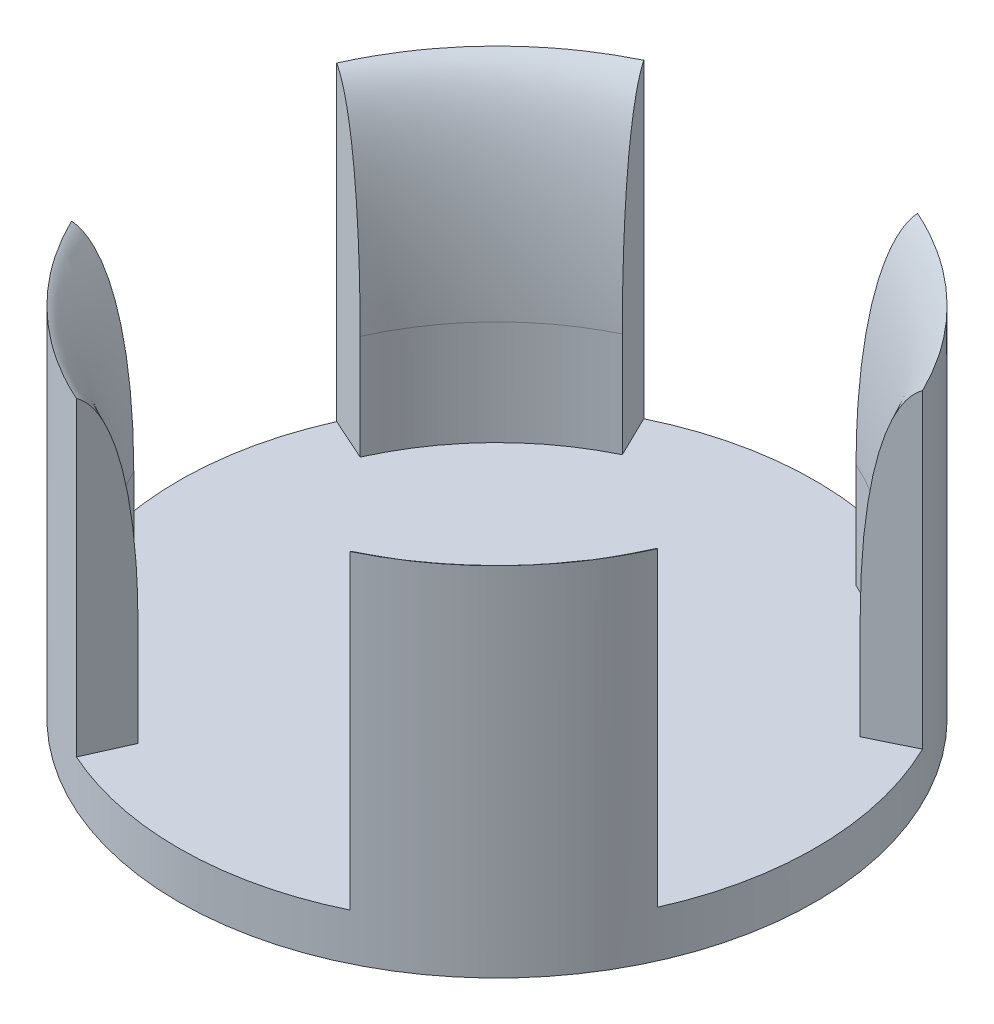
ISO-10303-21;
HEADER;
FILE_DESCRIPTION(('STEP AP214'),'2;1');
FILE_NAME('part.step','',(''),(''),'','','');
FILE_SCHEMA(('AUTOMOTIVE_DESIGN { 1 0 10303 214 1 1 1 1 }'));
ENDSEC;
DATA;
#1=APPLICATION_CONTEXT('core data for automotive mechanical design processes');
#2=APPLICATION_PROTOCOL_DEFINITION('international standard','automotive_design',2000,#1);
#3=PRODUCT_CONTEXT('',#1,'mechanical');
#4=PRODUCT('Part','Part','',(#3));
#5=PRODUCT_RELATED_PRODUCT_CATEGORY('part','',(#4));
#6=PRODUCT_DEFINITION_FORMATION('','',#4);
#7=PRODUCT_DEFINITION_CONTEXT('part definition',#1,'design');
#8=PRODUCT_DEFINITION('design','',#6,#7);
#9=PRODUCT_DEFINITION_SHAPE('','',#8);
#10=(LENGTH_UNIT() NAMED_UNIT(*) SI_UNIT(.MILLI.,.METRE.));
#11=(NAMED_UNIT(*) PLANE_ANGLE_UNIT() SI_UNIT($,.RADIAN.));
#12=(NAMED_UNIT(*) SI_UNIT($,.STERADIAN.) SOLID_ANGLE_UNIT());
#13=UNCERTAINTY_MEASURE_WITH_UNIT(LENGTH_MEASURE(1.E-05),#10,'distance_accuracy_value','');
#14=(GEOMETRIC_REPRESENTATION_CONTEXT(3) GLOBAL_UNCERTAINTY_ASSIGNED_CONTEXT((#13)) GLOBAL_UNIT_ASSIGNED_CONTEXT((#10,
#11,#12)) REPRESENTATION_CONTEXT('',''));
#15=CARTESIAN_POINT('',(0.,0.,0.));
#16=DIRECTION('',(0.,0.,1.));
#17=DIRECTION('',(1.,0.,0.));
#18=AXIS2_PLACEMENT_3D('',#15,#16,#17);
#19=CARTESIAN_POINT('',(0.,-3.,0.));
#20=DIRECTION('',(0.,1.,0.));
#21=DIRECTION('',(0.,0.,1.));
#22=AXIS2_PLACEMENT_3D('',#19,#20,#21);
#23=CYLINDRICAL_SURFACE('',#22,20.5);
#24=CARTESIAN_POINT('',(0.,-3.,0.));
#25=DIRECTION('',(0.,1.,0.));
#26=DIRECTION('',(0.,0.,1.));
#27=AXIS2_PLACEMENT_3D('',#24,#25,#26);
#28=CIRCLE('',#27,20.5);
#29=CARTESIAN_POINT('',(0.,-3.,20.5));
#30=VERTEX_POINT('',#29);
#31=EDGE_CURVE('E788',#30,#30,#28,.T.);
#32=ORIENTED_EDGE('',*,*,#31,.T.);
#33=EDGE_LOOP('',(#32));
#34=FACE_BOUND('',#33,.T.);
#35=CARTESIAN_POINT('',(0.,0.,0.));
#36=DIRECTION('',(0.,1.,0.));
#37=DIRECTION('',(0.,0.,1.));
#38=AXIS2_PLACEMENT_3D('',#35,#36,#37);
#39=CIRCLE('',#38,20.5);
#40=CARTESIAN_POINT('',(8.38234220932854,0.,-18.7079218270151));
#41=VERTEX_POINT('',#40);
#42=CARTESIAN_POINT('',(-8.97552418818276,0.,-18.4306800077302));
#43=VERTEX_POINT('',#42);
#44=EDGE_CURVE('E497',#41,#43,#39,.T.);
#45=ORIENTED_EDGE('',*,*,#44,.F.);
#46=DIRECTION('',(0.,-1.,0.));
#47=VECTOR('',#46,1.);
#48=CARTESIAN_POINT('',(8.38234220932854,20.,-18.7079218270151));
#49=LINE('',#48,#47);
#50=CARTESIAN_POINT('',(8.38231750512342,19.9999999999999,-18.7078666915498));
#51=VERTEX_POINT('',#50);
#52=EDGE_CURVE('E305',#51,#41,#49,.T.);
#53=ORIENTED_EDGE('',*,*,#52,.F.);
#54=CARTESIAN_POINT('',(18.7319601099859,19.9999999999999,-8.32848548284142));
#55=CARTESIAN_POINT('',(17.6685074621273,19.9999999999999,-10.7203432364903));
#56=CARTESIAN_POINT('',(16.1422940276784,20.000000000006,-12.9044962130154));
#57=CARTESIAN_POINT('',(12.3823921969383,19.9999999999938,-16.5461790897203));
#58=CARTESIAN_POINT('',(10.1506120525062,19.9999999999999,-18.0018607373686));
#59=CARTESIAN_POINT('',(7.7260118441926,19.9999999999999,-18.9883843700141));
#60=(BOUNDED_CURVE() B_SPLINE_CURVE(3,(#54,#55,#56,#57,#58,#59),.UNSPECIFIED.,.F.,
.F.) B_SPLINE_CURVE_WITH_KNOTS((4,2,4),(1.98916195742302,2.37216524610035,2.75516853477769),
.UNSPECIFIED.) CURVE() GEOMETRIC_REPRESENTATION_ITEM() RATIONAL_B_SPLINE_CURVE((1.,1.,1.,1.,1.,1.)) REPRESENTATION_ITEM(''));
#61=CARTESIAN_POINT('',(18.4305713709548,20.0000000000001,-8.97547128335208));
#62=VERTEX_POINT('',#61);
#63=EDGE_CURVE('E291',#62,#51,#60,.T.);
#64=ORIENTED_EDGE('',*,*,#63,.F.);
#65=DIRECTION('',(0.,-1.,0.));
#66=VECTOR('',#65,1.);
#67=CARTESIAN_POINT('',(18.4306800077302,20.,-8.97552418818276));
#68=LINE('',#67,#66);
#69=CARTESIAN_POINT('',(18.4306800077302,0.,-8.97552418818276));
#70=VERTEX_POINT('',#69);
#71=EDGE_CURVE('E343',#62,#70,#68,.T.);
#72=ORIENTED_EDGE('',*,*,#71,.T.);
#73=CARTESIAN_POINT('',(18.7079218270151,0.,8.38234220932854));
#74=VERTEX_POINT('',#73);
#75=EDGE_CURVE('E351',#74,#70,#39,.T.);
#76=ORIENTED_EDGE('',*,*,#75,.F.);
#77=DIRECTION('',(0.,-1.,0.));
#78=VECTOR('',#77,1.);
#79=CARTESIAN_POINT('',(18.7079218270151,20.,8.38234220932854));
#80=LINE('',#79,#78);
#81=CARTESIAN_POINT('',(18.7078666915517,20.,8.38231750512425));
#82=VERTEX_POINT('',#81);
#83=EDGE_CURVE('E823',#82,#74,#80,.T.);
#84=ORIENTED_EDGE('',*,*,#83,.F.);
#85=CARTESIAN_POINT('',(8.32848548284142,19.9999999999999,18.7319601099859));
#86=CARTESIAN_POINT('',(10.7203432364824,20.0000000000182,17.668507462122));
#87=CARTESIAN_POINT('',(12.9044962130225,19.9999999999999,16.1422940276777));
#88=CARTESIAN_POINT('',(16.5461790897131,19.9999999999999,12.382392196939));
#89=CARTESIAN_POINT('',(18.0018607373868,19.9999999999999,10.1506120525109));
#90=CARTESIAN_POINT('',(18.9883843700141,19.9999999999999,7.72601184419258));
#91=(BOUNDED_CURVE() B_SPLINE_CURVE(3,(#85,#86,#87,#88,#89,#90),.UNSPECIFIED.,.F.,
.F.) B_SPLINE_CURVE_WITH_KNOTS((4,2,4),(0.41836563062812,0.801368919305455,1.18437220798279),
.UNSPECIFIED.) CURVE() GEOMETRIC_REPRESENTATION_ITEM() RATIONAL_B_SPLINE_CURVE((1.,1.,1.,1.,1.,1.)) REPRESENTATION_ITEM(''));
#92=CARTESIAN_POINT('',(8.9754712833513,20.0000000000041,18.4305713709532));
#93=VERTEX_POINT('',#92);
#94=EDGE_CURVE('E799',#93,#82,#91,.T.);
#95=ORIENTED_EDGE('',*,*,#94,.F.);
#96=DIRECTION('',(0.,-1.,0.));
#97=VECTOR('',#96,1.);
#98=CARTESIAN_POINT('',(8.97552418818276,20.,18.4306800077302));
#99=LINE('',#98,#97);
#100=CARTESIAN_POINT('',(8.97552418818276,0.,18.4306800077302));
#101=VERTEX_POINT('',#100);
#102=EDGE_CURVE('E202',#93,#101,#99,.T.);
#103=ORIENTED_EDGE('',*,*,#102,.T.);
#104=CARTESIAN_POINT('',(-8.38234220932854,0.,18.7079218270151));
#105=VERTEX_POINT('',#104);
#106=EDGE_CURVE('E820',#105,#101,#39,.T.);
#107=ORIENTED_EDGE('',*,*,#106,.F.);
#108=DIRECTION('',(0.,-1.,0.));
#109=VECTOR('',#108,1.);
#110=CARTESIAN_POINT('',(-8.38234220932854,20.,18.7079218270151));
#111=LINE('',#110,#109);
#112=CARTESIAN_POINT('',(-8.38231750512343,20.0000000000007,18.7078666915498));
#113=VERTEX_POINT('',#112);
#114=EDGE_CURVE('E220',#113,#105,#111,.T.);
#115=ORIENTED_EDGE('',*,*,#114,.F.);
#116=CARTESIAN_POINT('',(-18.7319601099859,19.9999999999999,8.32848548284142));
#117=CARTESIAN_POINT('',(-17.6685074621352,20.000000000006,10.7203432364938));
#118=CARTESIAN_POINT('',(-16.1422940276831,19.9999999999999,12.9044962130175));
#119=CARTESIAN_POINT('',(-12.3823921969336,19.9999999999999,16.5461790897182));
#120=CARTESIAN_POINT('',(-10.1506120525088,20.000000000006,18.0018607373679));
#121=CARTESIAN_POINT('',(-7.72601184419254,19.9999999999999,18.9883843700142));
#122=(BOUNDED_CURVE() B_SPLINE_CURVE(3,(#116,#117,#118,#119,#120,#121),.UNSPECIFIED.,.F.,
.F.) B_SPLINE_CURVE_WITH_KNOTS((4,2,4),(5.13075461101281,5.51375789969014,5.89676118836748),
.UNSPECIFIED.) CURVE() GEOMETRIC_REPRESENTATION_ITEM() RATIONAL_B_SPLINE_CURVE((1.,1.,1.,1.,1.,1.)) REPRESENTATION_ITEM(''));
#123=CARTESIAN_POINT('',(-18.4305713709567,20.0000000000013,8.97547128335299));
#124=VERTEX_POINT('',#123);
#125=EDGE_CURVE('E174',#124,#113,#122,.T.);
#126=ORIENTED_EDGE('',*,*,#125,.F.);
#127=DIRECTION('',(0.,-1.,0.));
#128=VECTOR('',#127,1.);
#129=CARTESIAN_POINT('',(-18.4306800077302,20.,8.97552418818276));
#130=LINE('',#129,#128);
#131=CARTESIAN_POINT('',(-18.4306800077302,0.,8.97552418818276));
#132=VERTEX_POINT('',#131);
#133=EDGE_CURVE('E252',#124,#132,#130,.T.);
#134=ORIENTED_EDGE('',*,*,#133,.T.);
#135=CARTESIAN_POINT('',(-18.7079218270151,0.,-8.38234220932854));
#136=VERTEX_POINT('',#135);
#137=EDGE_CURVE('E200',#136,#132,#39,.T.);
#138=ORIENTED_EDGE('',*,*,#137,.F.);
#139=DIRECTION('',(0.,-1.,0.));
#140=VECTOR('',#139,1.);
#141=CARTESIAN_POINT('',(-18.7079218270151,20.,-8.38234220932854));
#142=LINE('',#141,#140);
#143=CARTESIAN_POINT('',(-18.7078666915496,19.9999999999972,-8.38231750512331));
#144=VERTEX_POINT('',#143);
#145=EDGE_CURVE('E500',#144,#136,#142,.T.);
#146=ORIENTED_EDGE('',*,*,#145,.F.);
#147=CARTESIAN_POINT('',(-8.32848548284142,19.9999999999999,-18.7319601099859));
#148=CARTESIAN_POINT('',(-10.7203432364868,19.9999999999999,-17.6685074621173));
#149=CARTESIAN_POINT('',(-12.9044962130154,20.000000000006,-16.1422940276815));
#150=CARTESIAN_POINT('',(-16.5461790897203,19.9999999999938,-12.3823921969352));
#151=CARTESIAN_POINT('',(-18.0018607373655,19.9999999999756,-10.1506120525072));
#152=CARTESIAN_POINT('',(-18.9883843700141,19.9999999999999,-7.72601184419257));
#153=(BOUNDED_CURVE() B_SPLINE_CURVE(3,(#147,#148,#149,#150,#151,#152),.UNSPECIFIED.,.F.,
.F.) B_SPLINE_CURVE_WITH_KNOTS((4,2,4),(3.55995828421791,3.94296157289525,4.32596486157258),
.UNSPECIFIED.) CURVE() GEOMETRIC_REPRESENTATION_ITEM() RATIONAL_B_SPLINE_CURVE((1.,1.,1.,1.,1.,1.)) REPRESENTATION_ITEM(''));
#154=CARTESIAN_POINT('',(-8.97547128335108,20.0000000000001,-18.4305713709528));
#155=VERTEX_POINT('',#154);
#156=EDGE_CURVE('E89',#155,#144,#153,.T.);
#157=ORIENTED_EDGE('',*,*,#156,.F.);
#158=DIRECTION('',(0.,-1.,0.));
#159=VECTOR('',#158,1.);
#160=CARTESIAN_POINT('',(-8.97552418818276,20.,-18.4306800077302));
#161=LINE('',#160,#159);
#162=EDGE_CURVE('E285',#155,#43,#161,.T.);
#163=ORIENTED_EDGE('',*,*,#162,.T.);
#164=EDGE_LOOP('',(#45,#53,#64,#72,#76,#84,#95,#103,#107,#115,#126,#134,#138,#146,#157,#163));
#165=FACE_BOUND('',#164,.T.);
#166=ADVANCED_FACE('F46',(#34,#165),#23,.T.);
#167=CARTESIAN_POINT('',(0.,-3.,0.));
#168=DIRECTION('',(0.,1.,0.));
#169=DIRECTION('',(0.,0.,1.));
#170=AXIS2_PLACEMENT_3D('',#167,#168,#169);
#171=PLANE('',#170);
#172=ORIENTED_EDGE('',*,*,#31,.F.);
#173=EDGE_LOOP('',(#172));
#174=FACE_BOUND('',#173,.T.);
#175=ADVANCED_FACE('F437',(#174),#171,.F.);
#176=CARTESIAN_POINT('',(0.,0.,0.));
#177=DIRECTION('',(0.,1.,0.));
#178=DIRECTION('',(0.,0.,1.));
#179=AXIS2_PLACEMENT_3D('',#176,#177,#178);
#180=PLANE('',#179);
#181=ORIENTED_EDGE('',*,*,#106,.T.);
#182=DIRECTION('',(0.437830448204037,0.,0.899057561352694));
#183=VECTOR('',#182,1.);
#184=CARTESIAN_POINT('',(0.,0.,0.));
#185=LINE('',#184,#183);
#186=CARTESIAN_POINT('',(7.66203284357065,0.,15.7335073236721));
#187=VERTEX_POINT('',#186);
#188=EDGE_CURVE('E810',#187,#101,#185,.T.);
#189=ORIENTED_EDGE('',*,*,#188,.F.);
#190=CARTESIAN_POINT('',(0.,0.,0.));
#191=DIRECTION('',(0.,1.,0.));
#192=DIRECTION('',(0.,0.,1.));
#193=AXIS2_PLACEMENT_3D('',#190,#191,#192);
#194=CIRCLE('',#193,17.5);
#195=CARTESIAN_POINT('',(15.9701771694032,0.,7.15565798357315));
#196=VERTEX_POINT('',#195);
#197=EDGE_CURVE('E804',#187,#196,#194,.T.);
#198=ORIENTED_EDGE('',*,*,#197,.T.);
#199=DIRECTION('',(0.912581552537324,0.,0.408894741918465));
#200=VECTOR('',#199,1.);
#201=CARTESIAN_POINT('',(0.,0.,0.));
#202=LINE('',#201,#200);
#203=EDGE_CURVE('E808',#196,#74,#202,.T.);
#204=ORIENTED_EDGE('',*,*,#203,.T.);
#205=ORIENTED_EDGE('',*,*,#75,.T.);
#206=DIRECTION('',(0.899057561352694,0.,-0.437830448204037));
#207=VECTOR('',#206,1.);
#208=CARTESIAN_POINT('',(0.,0.,0.));
#209=LINE('',#208,#207);
#210=CARTESIAN_POINT('',(15.7335073236721,0.,-7.66203284357065));
#211=VERTEX_POINT('',#210);
#212=EDGE_CURVE('E281',#211,#70,#209,.T.);
#213=ORIENTED_EDGE('',*,*,#212,.F.);
#214=CARTESIAN_POINT('',(0.,0.,0.));
#215=DIRECTION('',(0.,1.,0.));
#216=DIRECTION('',(0.,0.,1.));
#217=AXIS2_PLACEMENT_3D('',#214,#215,#216);
#218=CIRCLE('',#217,17.5);
#219=CARTESIAN_POINT('',(7.15565798357314,0.,-15.9701771694032));
#220=VERTEX_POINT('',#219);
#221=EDGE_CURVE('E288',#211,#220,#218,.T.);
#222=ORIENTED_EDGE('',*,*,#221,.T.);
#223=DIRECTION('',(0.408894741918465,0.,-0.912581552537324));
#224=VECTOR('',#223,1.);
#225=CARTESIAN_POINT('',(0.,0.,0.));
#226=LINE('',#225,#224);
#227=EDGE_CURVE('E284',#220,#41,#226,.T.);
#228=ORIENTED_EDGE('',*,*,#227,.T.);
#229=ORIENTED_EDGE('',*,*,#44,.T.);
#230=DIRECTION('',(-0.437830448204037,0.,-0.899057561352693));
#231=VECTOR('',#230,1.);
#232=CARTESIAN_POINT('',(0.,0.,0.));
#233=LINE('',#232,#231);
#234=CARTESIAN_POINT('',(-7.66203284357065,0.,-15.7335073236721));
#235=VERTEX_POINT('',#234);
#236=EDGE_CURVE('E259',#235,#43,#233,.T.);
#237=ORIENTED_EDGE('',*,*,#236,.F.);
#238=CARTESIAN_POINT('',(0.,0.,0.));
#239=DIRECTION('',(0.,1.,0.));
#240=DIRECTION('',(0.,0.,1.));
#241=AXIS2_PLACEMENT_3D('',#238,#239,#240);
#242=CIRCLE('',#241,17.5);
#243=CARTESIAN_POINT('',(-15.9701771694032,0.,-7.15565798357314));
#244=VERTEX_POINT('',#243);
#245=EDGE_CURVE('E277',#235,#244,#242,.T.);
#246=ORIENTED_EDGE('',*,*,#245,.T.);
#247=DIRECTION('',(-0.912581552537324,0.,-0.408894741918465));
#248=VECTOR('',#247,1.);
#249=CARTESIAN_POINT('',(0.,0.,0.));
#250=LINE('',#249,#248);
#251=EDGE_CURVE('E493',#244,#136,#250,.T.);
#252=ORIENTED_EDGE('',*,*,#251,.T.);
#253=ORIENTED_EDGE('',*,*,#137,.T.);
#254=DIRECTION('',(-0.899057561352694,0.,0.437830448204037));
#255=VECTOR('',#254,1.);
#256=CARTESIAN_POINT('',(0.,0.,0.));
#257=LINE('',#256,#255);
#258=CARTESIAN_POINT('',(-15.7335073236721,0.,7.66203284357065));
#259=VERTEX_POINT('',#258);
#260=EDGE_CURVE('E184',#259,#132,#257,.T.);
#261=ORIENTED_EDGE('',*,*,#260,.F.);
#262=CARTESIAN_POINT('',(0.,0.,0.));
#263=DIRECTION('',(0.,1.,0.));
#264=DIRECTION('',(0.,0.,1.));
#265=AXIS2_PLACEMENT_3D('',#262,#263,#264);
#266=CIRCLE('',#265,17.5);
#267=CARTESIAN_POINT('',(-7.15565798357314,0.,15.9701771694032));
#268=VERTEX_POINT('',#267);
#269=EDGE_CURVE('E197',#259,#268,#266,.T.);
#270=ORIENTED_EDGE('',*,*,#269,.T.);
#271=DIRECTION('',(-0.408894741918465,0.,0.912581552537324));
#272=VECTOR('',#271,1.);
#273=CARTESIAN_POINT('',(0.,0.,0.));
#274=LINE('',#273,#272);
#275=EDGE_CURVE('E201',#268,#105,#274,.T.);
#276=ORIENTED_EDGE('',*,*,#275,.T.);
#277=EDGE_LOOP('',(#181,#189,#198,#204,#205,#213,#222,#228,#229,#237,#246,#252,#253,#261,#270,#276));
#278=FACE_BOUND('',#277,.T.);
#279=ADVANCED_FACE('F196',(#278),#180,.T.);
#280=CARTESIAN_POINT('',(0.,20.,0.));
#281=DIRECTION('',(-0.437830448204037,0.,-0.899057561352694));
#282=DIRECTION('',(-0.899057561352694,0.,0.437830448204037));
#283=AXIS2_PLACEMENT_3D('',#280,#281,#282);
#284=PLANE('',#283);
#285=ORIENTED_EDGE('',*,*,#71,.F.);
#286=CARTESIAN_POINT('',(15.7334145849637,6.73350083857774,-7.66198768091128));
#287=CARTESIAN_POINT('',(15.7334145849574,18.4170654409668,-7.66198768090835));
#288=CARTESIAN_POINT('',(18.4305713709548,20.0000000000001,-8.97547128335218));
#289=(BOUNDED_CURVE() B_SPLINE_CURVE(2,(#286,#287,#288),.UNSPECIFIED.,.F.,
.F.) B_SPLINE_CURVE_WITH_KNOTS((3,3),(0.,1.),
.UNSPECIFIED.) CURVE() GEOMETRIC_REPRESENTATION_ITEM() RATIONAL_B_SPLINE_CURVE((1.,
0.856348838577675,1.)) REPRESENTATION_ITEM(''));
#290=CARTESIAN_POINT('',(15.7334609612195,6.73350083857774,-7.66201024807991));
#291=VERTEX_POINT('',#290);
#292=EDGE_CURVE('E356',#62,#291,#289,.F.);
#293=ORIENTED_EDGE('',*,*,#292,.T.);
#294=DIRECTION('',(0.,-1.,0.));
#295=VECTOR('',#294,1.);
#296=CARTESIAN_POINT('',(15.7335073236721,20.,-7.66203284357065));
#297=LINE('',#296,#295);
#298=EDGE_CURVE('E297',#291,#211,#297,.T.);
#299=ORIENTED_EDGE('',*,*,#298,.T.);
#300=ORIENTED_EDGE('',*,*,#212,.T.);
#301=EDGE_LOOP('',(#285,#293,#299,#300));
#302=FACE_BOUND('',#301,.T.);
#303=ADVANCED_FACE('F334',(#302),#284,.F.);
#304=CARTESIAN_POINT('',(0.,20.,0.));
#305=DIRECTION('',(-0.912581552537324,0.,-0.408894741918465));
#306=DIRECTION('',(-0.408894741918465,0.,0.912581552537324));
#307=AXIS2_PLACEMENT_3D('',#304,#305,#306);
#308=PLANE('',#307);
#309=DIRECTION('',(0.,-1.,0.));
#310=VECTOR('',#309,1.);
#311=CARTESIAN_POINT('',(7.15565798357314,20.,-15.9701771694032));
#312=LINE('',#311,#310);
#313=CARTESIAN_POINT('',(7.15563689461738,6.7335008385741,-15.9701301025421));
#314=VERTEX_POINT('',#313);
#315=EDGE_CURVE('E300',#314,#220,#312,.T.);
#316=ORIENTED_EDGE('',*,*,#315,.F.);
#317=CARTESIAN_POINT('',(8.38229280091843,19.9999999999998,-18.7078115560845));
#318=CARTESIAN_POINT('',(7.15561580565765,18.4170654409652,-15.9700830356737));
#319=CARTESIAN_POINT('',(7.15561580566179,6.7335008385741,-15.970083035681));
#320=(BOUNDED_CURVE() B_SPLINE_CURVE(2,(#317,#318,#319),.UNSPECIFIED.,.F.,
.F.) B_SPLINE_CURVE_WITH_KNOTS((3,3),(0.,1.),
.UNSPECIFIED.) CURVE() GEOMETRIC_REPRESENTATION_ITEM() RATIONAL_B_SPLINE_CURVE((1.,
0.856348838577675,1.)) REPRESENTATION_ITEM(''));
#321=EDGE_CURVE('E361',#314,#51,#320,.F.);
#322=ORIENTED_EDGE('',*,*,#321,.T.);
#323=ORIENTED_EDGE('',*,*,#52,.T.);
#324=ORIENTED_EDGE('',*,*,#227,.F.);
#325=EDGE_LOOP('',(#316,#322,#323,#324));
#326=FACE_BOUND('',#325,.T.);
#327=ADVANCED_FACE('F329',(#326),#308,.T.);
#328=CARTESIAN_POINT('',(0.,20.,0.));
#329=DIRECTION('',(0.,-1.,0.));
#330=DIRECTION('',(0.,0.,-1.));
#331=AXIS2_PLACEMENT_3D('',#328,#329,#330);
#332=CYLINDRICAL_SURFACE('',#331,17.5);
#333=ORIENTED_EDGE('',*,*,#298,.F.);
#334=CARTESIAN_POINT('',(6.59537596455465,6.73350083857832,-16.2095964134267));
#335=CARTESIAN_POINT('',(8.66515663018708,6.73350083856005,-15.3674420928722));
#336=CARTESIAN_POINT('',(10.5703348022635,6.73350083857375,-14.1247870278088));
#337=CARTESIAN_POINT('',(13.7800070967995,6.73350083858289,-11.0160333525754));
#338=CARTESIAN_POINT('',(15.0828722237773,6.73350083857527,-9.15151251895895));
#339=CARTESIAN_POINT('',(15.9906976548659,6.73350083857832,-7.10968272925486));
#340=(BOUNDED_CURVE() B_SPLINE_CURVE(3,(#334,#335,#336,#337,#338,#339),.UNSPECIFIED.,.F.,
.F.) B_SPLINE_CURVE_WITH_KNOTS((4,2,4),(1.98916195742302,2.37216524610035,2.75516853477769),
.UNSPECIFIED.) CURVE() GEOMETRIC_REPRESENTATION_ITEM() RATIONAL_B_SPLINE_CURVE((1.,1.,1.,1.,1.,1.)) REPRESENTATION_ITEM(''));
#341=EDGE_CURVE('E311',#291,#314,#340,.F.);
#342=ORIENTED_EDGE('',*,*,#341,.T.);
#343=ORIENTED_EDGE('',*,*,#315,.T.);
#344=ORIENTED_EDGE('',*,*,#221,.F.);
#345=EDGE_LOOP('',(#333,#342,#343,#344));
#346=FACE_BOUND('',#345,.T.);
#347=ADVANCED_FACE('F318',(#346),#332,.F.);
#348=CARTESIAN_POINT('',(0.,20.,0.));
#349=DIRECTION('',(-0.899057561352693,0.,0.437830448204037));
#350=DIRECTION('',(0.437830448204037,0.,0.899057561352693));
#351=AXIS2_PLACEMENT_3D('',#348,#349,#350);
#352=PLANE('',#351);
#353=ORIENTED_EDGE('',*,*,#162,.F.);
#354=CARTESIAN_POINT('',(-7.66198768091121,6.73350083858007,-15.7334145849637));
#355=CARTESIAN_POINT('',(-7.66198768091212,18.4170654409653,-15.7334145849659));
#356=CARTESIAN_POINT('',(-8.9754712833513,20.0000000000001,-18.4305713709527));
#357=(BOUNDED_CURVE() B_SPLINE_CURVE(2,(#354,#355,#356),.UNSPECIFIED.,.F.,
.F.) B_SPLINE_CURVE_WITH_KNOTS((3,3),(0.,1.),
.UNSPECIFIED.) CURVE() GEOMETRIC_REPRESENTATION_ITEM() RATIONAL_B_SPLINE_CURVE((1.,
0.856348838577675,1.)) REPRESENTATION_ITEM(''));
#358=CARTESIAN_POINT('',(-7.6620102480799,6.73350083858007,-15.7334609612195));
#359=VERTEX_POINT('',#358);
#360=EDGE_CURVE('E12',#155,#359,#357,.F.);
#361=ORIENTED_EDGE('',*,*,#360,.T.);
#362=DIRECTION('',(0.,-1.,0.));
#363=VECTOR('',#362,1.);
#364=CARTESIAN_POINT('',(-7.66203284357065,20.,-15.7335073236721));
#365=LINE('',#364,#363);
#366=EDGE_CURVE('E97',#359,#235,#365,.T.);
#367=ORIENTED_EDGE('',*,*,#366,.T.);
#368=ORIENTED_EDGE('',*,*,#236,.T.);
#369=EDGE_LOOP('',(#353,#361,#367,#368));
#370=FACE_BOUND('',#369,.T.);
#371=ADVANCED_FACE('F328',(#370),#352,.F.);
#372=CARTESIAN_POINT('',(0.,20.,0.));
#373=DIRECTION('',(-0.408894741918465,0.,0.912581552537324));
#374=DIRECTION('',(0.912581552537324,0.,0.408894741918465));
#375=AXIS2_PLACEMENT_3D('',#372,#373,#374);
#376=PLANE('',#375);
#377=DIRECTION('',(0.,-1.,0.));
#378=VECTOR('',#377,1.);
#379=CARTESIAN_POINT('',(-15.9701771694032,20.,-7.15565798357314));
#380=LINE('',#379,#378);
#381=CARTESIAN_POINT('',(-15.9701301025421,6.73350083857417,-7.15563689461738));
#382=VERTEX_POINT('',#381);
#383=EDGE_CURVE('E272',#382,#244,#380,.T.);
#384=ORIENTED_EDGE('',*,*,#383,.F.);
#385=CARTESIAN_POINT('',(-18.7078115560839,19.9999999999943,-8.3822928009182));
#386=CARTESIAN_POINT('',(-15.9700830356851,18.4170654409612,-7.15561580566376));
#387=CARTESIAN_POINT('',(-15.9700830356812,6.73350083857417,-7.15561580566147));
#388=(BOUNDED_CURVE() B_SPLINE_CURVE(2,(#385,#386,#387),.UNSPECIFIED.,.F.,
.F.) B_SPLINE_CURVE_WITH_KNOTS((3,3),(0.,1.),
.UNSPECIFIED.) CURVE() GEOMETRIC_REPRESENTATION_ITEM() RATIONAL_B_SPLINE_CURVE((1.,
0.856348838577675,1.)) REPRESENTATION_ITEM(''));
#389=EDGE_CURVE('E62',#382,#144,#388,.F.);
#390=ORIENTED_EDGE('',*,*,#389,.T.);
#391=ORIENTED_EDGE('',*,*,#145,.T.);
#392=ORIENTED_EDGE('',*,*,#251,.F.);
#393=EDGE_LOOP('',(#384,#390,#391,#392));
#394=FACE_BOUND('',#393,.T.);
#395=ADVANCED_FACE('F512',(#394),#376,.T.);
#396=CARTESIAN_POINT('',(0.,20.,0.));
#397=DIRECTION('',(0.,-1.,0.));
#398=DIRECTION('',(0.,0.,-1.));
#399=AXIS2_PLACEMENT_3D('',#396,#397,#398);
#400=CYLINDRICAL_SURFACE('',#399,17.5);
#401=ORIENTED_EDGE('',*,*,#366,.F.);
#402=CARTESIAN_POINT('',(-16.2095964134267,6.73350083857832,-6.59537596455462));
#403=CARTESIAN_POINT('',(-15.3674420928721,6.73350083856005,-8.66515663018718));
#404=CARTESIAN_POINT('',(-14.1247870278089,6.7335008385768,-10.5703348022634));
#405=CARTESIAN_POINT('',(-11.0160333525753,6.73350083857984,-13.7800070967996));
#406=CARTESIAN_POINT('',(-9.15151251895903,6.73350083858593,-15.0828722237772));
#407=CARTESIAN_POINT('',(-7.10968272925486,6.73350083857832,-15.9906976548659));
#408=(BOUNDED_CURVE() B_SPLINE_CURVE(3,(#402,#403,#404,#405,#406,#407),.UNSPECIFIED.,.F.,
.F.) B_SPLINE_CURVE_WITH_KNOTS((4,2,4),(3.55995828421791,3.94296157289525,4.32596486157258),
.UNSPECIFIED.) CURVE() GEOMETRIC_REPRESENTATION_ITEM() RATIONAL_B_SPLINE_CURVE((1.,1.,1.,1.,1.,1.)) REPRESENTATION_ITEM(''));
#409=EDGE_CURVE('E466',#359,#382,#408,.F.);
#410=ORIENTED_EDGE('',*,*,#409,.T.);
#411=ORIENTED_EDGE('',*,*,#383,.T.);
#412=ORIENTED_EDGE('',*,*,#245,.F.);
#413=EDGE_LOOP('',(#401,#410,#411,#412));
#414=FACE_BOUND('',#413,.T.);
#415=ADVANCED_FACE('F499',(#414),#400,.F.);
#416=CARTESIAN_POINT('',(0.,20.,0.));
#417=DIRECTION('',(0.437830448204037,0.,0.899057561352694));
#418=DIRECTION('',(0.899057561352694,0.,-0.437830448204037));
#419=AXIS2_PLACEMENT_3D('',#416,#417,#418);
#420=PLANE('',#419);
#421=ORIENTED_EDGE('',*,*,#133,.F.);
#422=CARTESIAN_POINT('',(-15.7334145849637,6.73350083857863,7.66198768091114));
#423=CARTESIAN_POINT('',(-15.7334145849629,18.417065440968,7.66198768091119));
#424=CARTESIAN_POINT('',(-18.4305713709566,20.0000000000013,8.97547128335327));
#425=(BOUNDED_CURVE() B_SPLINE_CURVE(2,(#422,#423,#424),.UNSPECIFIED.,.F.,
.F.) B_SPLINE_CURVE_WITH_KNOTS((3,3),(0.,1.),
.UNSPECIFIED.) CURVE() GEOMETRIC_REPRESENTATION_ITEM() RATIONAL_B_SPLINE_CURVE((1.,
0.856348838577675,1.)) REPRESENTATION_ITEM(''));
#426=CARTESIAN_POINT('',(-15.7334609612195,6.73350083857863,7.6620102480799));
#427=VERTEX_POINT('',#426);
#428=EDGE_CURVE('E186',#124,#427,#425,.F.);
#429=ORIENTED_EDGE('',*,*,#428,.T.);
#430=DIRECTION('',(0.,-1.,0.));
#431=VECTOR('',#430,1.);
#432=CARTESIAN_POINT('',(-15.7335073236721,20.,7.66203284357065));
#433=LINE('',#432,#431);
#434=EDGE_CURVE('E181',#427,#259,#433,.T.);
#435=ORIENTED_EDGE('',*,*,#434,.T.);
#436=ORIENTED_EDGE('',*,*,#260,.T.);
#437=EDGE_LOOP('',(#421,#429,#435,#436));
#438=FACE_BOUND('',#437,.T.);
#439=ADVANCED_FACE('F183',(#438),#420,.F.);
#440=CARTESIAN_POINT('',(0.,20.,0.));
#441=DIRECTION('',(0.912581552537324,0.,0.408894741918465));
#442=DIRECTION('',(0.408894741918465,0.,-0.912581552537324));
#443=AXIS2_PLACEMENT_3D('',#440,#441,#442);
#444=PLANE('',#443);
#445=DIRECTION('',(0.,-1.,0.));
#446=VECTOR('',#445,1.);
#447=CARTESIAN_POINT('',(-7.15565798357314,20.,15.9701771694032));
#448=LINE('',#447,#446);
#449=CARTESIAN_POINT('',(-7.15563689461737,6.7335008385787,15.9701301025421));
#450=VERTEX_POINT('',#449);
#451=EDGE_CURVE('E192',#450,#268,#448,.T.);
#452=ORIENTED_EDGE('',*,*,#451,.F.);
#453=CARTESIAN_POINT('',(-8.38229280091873,20.0000000000013,18.7078115560843));
#454=CARTESIAN_POINT('',(-7.15561580566605,18.417065440968,15.9700830356924));
#455=CARTESIAN_POINT('',(-7.15561580566128,6.7335008385787,15.9700830356812));
#456=(BOUNDED_CURVE() B_SPLINE_CURVE(2,(#453,#454,#455),.UNSPECIFIED.,.F.,
.F.) B_SPLINE_CURVE_WITH_KNOTS((3,3),(0.,1.),
.UNSPECIFIED.) CURVE() GEOMETRIC_REPRESENTATION_ITEM() RATIONAL_B_SPLINE_CURVE((1.,
0.856348838577675,1.)) REPRESENTATION_ITEM(''));
#457=EDGE_CURVE('E872',#450,#113,#456,.F.);
#458=ORIENTED_EDGE('',*,*,#457,.T.);
#459=ORIENTED_EDGE('',*,*,#114,.T.);
#460=ORIENTED_EDGE('',*,*,#275,.F.);
#461=EDGE_LOOP('',(#452,#458,#459,#460));
#462=FACE_BOUND('',#461,.T.);
#463=ADVANCED_FACE('F238',(#462),#444,.T.);
#464=CARTESIAN_POINT('',(0.,20.,0.));
#465=DIRECTION('',(0.,-1.,0.));
#466=DIRECTION('',(0.,0.,-1.));
#467=AXIS2_PLACEMENT_3D('',#464,#465,#466);
#468=CYLINDRICAL_SURFACE('',#467,17.5);
#469=ORIENTED_EDGE('',*,*,#434,.F.);
#470=CARTESIAN_POINT('',(-6.5953759645546,6.73350083857832,16.2095964134267));
#471=CARTESIAN_POINT('',(-8.66515663018527,6.73350083857984,15.3674420928729));
#472=CARTESIAN_POINT('',(-10.5703348022655,6.73350083857984,14.1247870278068));
#473=CARTESIAN_POINT('',(-13.7800070967975,6.7335008385768,11.0160333525773));
#474=CARTESIAN_POINT('',(-15.0828722237781,6.73350083857984,9.15151251895719));
#475=CARTESIAN_POINT('',(-15.990697654866,6.73350083857832,7.10968272925486));
#476=(BOUNDED_CURVE() B_SPLINE_CURVE(3,(#470,#471,#472,#473,#474,#475),.UNSPECIFIED.,.F.,
.F.) B_SPLINE_CURVE_WITH_KNOTS((4,2,4),(5.13075461101281,5.51375789969014,5.89676118836748),
.UNSPECIFIED.) CURVE() GEOMETRIC_REPRESENTATION_ITEM() RATIONAL_B_SPLINE_CURVE((1.,1.,1.,1.,1.,1.)) REPRESENTATION_ITEM(''));
#477=EDGE_CURVE('E222',#427,#450,#476,.F.);
#478=ORIENTED_EDGE('',*,*,#477,.T.);
#479=ORIENTED_EDGE('',*,*,#451,.T.);
#480=ORIENTED_EDGE('',*,*,#269,.F.);
#481=EDGE_LOOP('',(#469,#478,#479,#480));
#482=FACE_BOUND('',#481,.T.);
#483=ADVANCED_FACE('F204',(#482),#468,.F.);
#484=CARTESIAN_POINT('',(0.,20.,0.));
#485=DIRECTION('',(0.899057561352694,0.,-0.437830448204037));
#486=DIRECTION('',(-0.437830448204037,0.,-0.899057561352694));
#487=AXIS2_PLACEMENT_3D('',#484,#485,#486);
#488=PLANE('',#487);
#489=ORIENTED_EDGE('',*,*,#102,.F.);
#490=CARTESIAN_POINT('',(7.66198768091166,6.73350083858244,15.7334145849634));
#491=CARTESIAN_POINT('',(7.66198768091432,18.4170654409804,15.733414584972));
#492=CARTESIAN_POINT('',(8.97547128335151,20.000000000004,18.4305713709531));
#493=(BOUNDED_CURVE() B_SPLINE_CURVE(2,(#490,#491,#492),.UNSPECIFIED.,.F.,
.F.) B_SPLINE_CURVE_WITH_KNOTS((3,3),(0.,1.),
.UNSPECIFIED.) CURVE() GEOMETRIC_REPRESENTATION_ITEM() RATIONAL_B_SPLINE_CURVE((1.,
0.856348838577675,1.)) REPRESENTATION_ITEM(''));
#494=CARTESIAN_POINT('',(7.6620102480799,6.73350083858244,15.7334609612195));
#495=VERTEX_POINT('',#494);
#496=EDGE_CURVE('E366',#93,#495,#493,.F.);
#497=ORIENTED_EDGE('',*,*,#496,.T.);
#498=DIRECTION('',(0.,-1.,0.));
#499=VECTOR('',#498,1.);
#500=CARTESIAN_POINT('',(7.66203284357065,20.,15.7335073236721));
#501=LINE('',#500,#499);
#502=EDGE_CURVE('E794',#495,#187,#501,.T.);
#503=ORIENTED_EDGE('',*,*,#502,.T.);
#504=ORIENTED_EDGE('',*,*,#188,.T.);
#505=EDGE_LOOP('',(#489,#497,#503,#504));
#506=FACE_BOUND('',#505,.T.);
#507=ADVANCED_FACE('F237',(#506),#488,.F.);
#508=CARTESIAN_POINT('',(0.,20.,0.));
#509=DIRECTION('',(0.408894741918465,0.,-0.912581552537324));
#510=DIRECTION('',(-0.912581552537324,0.,-0.408894741918465));
#511=AXIS2_PLACEMENT_3D('',#508,#509,#510);
#512=PLANE('',#511);
#513=DIRECTION('',(0.,-1.,0.));
#514=VECTOR('',#513,1.);
#515=CARTESIAN_POINT('',(15.9701771694032,20.,7.15565798357315));
#516=LINE('',#515,#514);
#517=CARTESIAN_POINT('',(15.9701301025421,6.7335008385766,7.15563689461738));
#518=VERTEX_POINT('',#517);
#519=EDGE_CURVE('E798',#518,#196,#516,.T.);
#520=ORIENTED_EDGE('',*,*,#519,.F.);
#521=CARTESIAN_POINT('',(18.7078115560882,19.9999999999999,8.38229280091989));
#522=CARTESIAN_POINT('',(15.9700830356815,18.4170654409667,7.15561580566177));
#523=CARTESIAN_POINT('',(15.970083035681,6.7335008385766,7.15561580566167));
#524=(BOUNDED_CURVE() B_SPLINE_CURVE(2,(#521,#522,#523),.UNSPECIFIED.,.F.,
.F.) B_SPLINE_CURVE_WITH_KNOTS((3,3),(0.,1.),
.UNSPECIFIED.) CURVE() GEOMETRIC_REPRESENTATION_ITEM() RATIONAL_B_SPLINE_CURVE((1.,
0.856348838577675,1.)) REPRESENTATION_ITEM(''));
#525=EDGE_CURVE('E791',#518,#82,#524,.F.);
#526=ORIENTED_EDGE('',*,*,#525,.T.);
#527=ORIENTED_EDGE('',*,*,#83,.T.);
#528=ORIENTED_EDGE('',*,*,#203,.F.);
#529=EDGE_LOOP('',(#520,#526,#527,#528));
#530=FACE_BOUND('',#529,.T.);
#531=ADVANCED_FACE('F541',(#530),#512,.T.);
#532=CARTESIAN_POINT('',(0.,20.,0.));
#533=DIRECTION('',(0.,-1.,0.));
#534=DIRECTION('',(0.,0.,-1.));
#535=AXIS2_PLACEMENT_3D('',#532,#533,#534);
#536=CYLINDRICAL_SURFACE('',#535,17.5);
#537=ORIENTED_EDGE('',*,*,#502,.F.);
#538=CARTESIAN_POINT('',(16.2095964134267,6.73350083857832,6.59537596455464));
#539=CARTESIAN_POINT('',(15.3674420928731,6.73350083857071,8.66515663018485));
#540=CARTESIAN_POINT('',(14.1247870278063,6.73350083857832,10.570334802266));
#541=CARTESIAN_POINT('',(11.0160333525777,6.73350083857832,13.780007096797));
#542=CARTESIAN_POINT('',(9.15151251895678,6.73350083859659,15.0828722237782));
#543=CARTESIAN_POINT('',(7.10968272925486,6.73350083857832,15.9906976548659));
#544=(BOUNDED_CURVE() B_SPLINE_CURVE(3,(#538,#539,#540,#541,#542,#543),.UNSPECIFIED.,.F.,
.F.) B_SPLINE_CURVE_WITH_KNOTS((4,2,4),(0.41836563062812,0.801368919305455,1.18437220798279),
.UNSPECIFIED.) CURVE() GEOMETRIC_REPRESENTATION_ITEM() RATIONAL_B_SPLINE_CURVE((1.,1.,1.,1.,1.,1.)) REPRESENTATION_ITEM(''));
#545=EDGE_CURVE('E789',#495,#518,#544,.F.);
#546=ORIENTED_EDGE('',*,*,#545,.T.);
#547=ORIENTED_EDGE('',*,*,#519,.T.);
#548=ORIENTED_EDGE('',*,*,#197,.F.);
#549=EDGE_LOOP('',(#537,#546,#547,#548));
#550=FACE_BOUND('',#549,.T.);
#551=ADVANCED_FACE('F548',(#550),#536,.F.);
#552=CARTESIAN_POINT('',(7.10968272925486,6.73350083857832,15.9906976548659));
#553=CARTESIAN_POINT('',(9.15151251895678,6.73350083859659,15.0828722237782));
#554=CARTESIAN_POINT('',(11.0160333525777,6.73350083857832,13.780007096797));
#555=CARTESIAN_POINT('',(14.1247870278063,6.73350083857832,10.570334802266));
#556=CARTESIAN_POINT('',(15.3674420928731,6.73350083857071,8.66515663018485));
#557=CARTESIAN_POINT('',(16.2095964134267,6.73350083857832,6.59537596455464));
#558=CARTESIAN_POINT('',(7.10968272925486,18.4170654409667,15.9906976548659));
#559=CARTESIAN_POINT('',(9.15151251896762,18.4170654410276,15.0828722238161));
#560=CARTESIAN_POINT('',(11.0160333525872,18.4170654409667,13.7800070968003));
#561=CARTESIAN_POINT('',(14.1247870277969,18.4170654409667,10.5703348022627));
#562=CARTESIAN_POINT('',(15.3674420928761,18.4170654409667,8.66515663018562));
#563=CARTESIAN_POINT('',(16.2095964134267,18.4170654409667,6.59537596455464));
#564=CARTESIAN_POINT('',(8.32848548284142,19.9999999999999,18.7319601099859));
#565=CARTESIAN_POINT('',(10.7203432364824,20.0000000000182,17.668507462122));
#566=CARTESIAN_POINT('',(12.9044962130225,19.9999999999999,16.1422940276777));
#567=CARTESIAN_POINT('',(16.5461790897131,19.9999999999999,12.382392196939));
#568=CARTESIAN_POINT('',(18.0018607373868,19.9999999999999,10.1506120525109));
#569=CARTESIAN_POINT('',(18.9883843700141,19.9999999999999,7.72601184419258));
#570=(BOUNDED_SURFACE() B_SPLINE_SURFACE(2,3,((#552,#553,#554,#555,#556,#557),(#558,#559,#560,
#561,#562,#563),(#564,#565,#566,#567,#568,#569)),.UNSPECIFIED.,.F.,.F.,
.F.) B_SPLINE_SURFACE_WITH_KNOTS((3,3),(4,2,4),(0.,1.),(0.41836563062812,0.801368919305455,
1.18437220798279),.UNSPECIFIED.) GEOMETRIC_REPRESENTATION_ITEM() RATIONAL_B_SPLINE_SURFACE(((1.,
1.,1.,1.,1.,1.),(0.856348838577675,0.856348838577675,0.856348838577675,0.856348838577675,
0.856348838577675,0.856348838577675),(1.,1.,1.,1.,1.,1.))) REPRESENTATION_ITEM('') SURFACE());
#571=ORIENTED_EDGE('',*,*,#496,.F.);
#572=ORIENTED_EDGE('',*,*,#94,.T.);
#573=ORIENTED_EDGE('',*,*,#525,.F.);
#574=ORIENTED_EDGE('',*,*,#545,.F.);
#575=EDGE_LOOP('',(#571,#572,#573,#574));
#576=FACE_BOUND('',#575,.T.);
#577=ADVANCED_FACE('F391',(#576),#570,.T.);
#578=CARTESIAN_POINT('',(15.9906976548659,6.73350083857832,-7.10968272925486));
#579=CARTESIAN_POINT('',(15.0828722237773,6.73350083857527,-9.15151251895895));
#580=CARTESIAN_POINT('',(13.7800070967995,6.73350083858289,-11.0160333525754));
#581=CARTESIAN_POINT('',(10.5703348022635,6.73350083857375,-14.1247870278088));
#582=CARTESIAN_POINT('',(8.66515663018708,6.73350083856005,-15.3674420928722));
#583=CARTESIAN_POINT('',(6.59537596455465,6.73350083857832,-16.2095964134267));
#584=CARTESIAN_POINT('',(15.9906976548659,18.4170654409667,-7.10968272925486));
#585=CARTESIAN_POINT('',(15.0828722237504,18.4170654409667,-9.15151251894626));
#586=CARTESIAN_POINT('',(13.7800070967905,18.4170654409728,-11.0160333525723));
#587=CARTESIAN_POINT('',(10.5703348022725,18.4170654409606,-14.1247870278118));
#588=CARTESIAN_POINT('',(8.66515663016779,18.4170654409606,-15.3674420928392));
#589=CARTESIAN_POINT('',(6.59537596455466,18.4170654409667,-16.2095964134267));
#590=CARTESIAN_POINT('',(18.7319601099859,19.9999999999999,-8.32848548284142));
#591=CARTESIAN_POINT('',(17.6685074621273,19.9999999999999,-10.7203432364903));
#592=CARTESIAN_POINT('',(16.1422940276784,20.000000000006,-12.9044962130154));
#593=CARTESIAN_POINT('',(12.3823921969383,19.9999999999938,-16.5461790897203));
#594=CARTESIAN_POINT('',(10.1506120525062,19.9999999999999,-18.0018607373686));
#595=CARTESIAN_POINT('',(7.7260118441926,19.9999999999999,-18.9883843700141));
#596=(BOUNDED_SURFACE() B_SPLINE_SURFACE(2,3,((#578,#579,#580,#581,#582,#583),(#584,#585,#586,
#587,#588,#589),(#590,#591,#592,#593,#594,#595)),.UNSPECIFIED.,.F.,.F.,
.F.) B_SPLINE_SURFACE_WITH_KNOTS((3,3),(4,2,4),(0.,1.),(1.98916195742302,2.37216524610035,
2.75516853477769),.UNSPECIFIED.) GEOMETRIC_REPRESENTATION_ITEM() RATIONAL_B_SPLINE_SURFACE(((1.,
1.,1.,1.,1.,1.),(0.856348838577675,0.856348838577675,0.856348838577675,0.856348838577675,
0.856348838577675,0.856348838577675),(1.,1.,1.,1.,1.,1.))) REPRESENTATION_ITEM('') SURFACE());
#597=ORIENTED_EDGE('',*,*,#292,.F.);
#598=ORIENTED_EDGE('',*,*,#63,.T.);
#599=ORIENTED_EDGE('',*,*,#321,.F.);
#600=ORIENTED_EDGE('',*,*,#341,.F.);
#601=EDGE_LOOP('',(#597,#598,#599,#600));
#602=FACE_BOUND('',#601,.T.);
#603=ADVANCED_FACE('F364',(#602),#596,.T.);
#604=CARTESIAN_POINT('',(-15.990697654866,6.73350083857832,7.10968272925486));
#605=CARTESIAN_POINT('',(-15.0828722237781,6.73350083857984,9.15151251895719));
#606=CARTESIAN_POINT('',(-13.7800070967975,6.7335008385768,11.0160333525773));
#607=CARTESIAN_POINT('',(-10.5703348022655,6.73350083857984,14.1247870278068));
#608=CARTESIAN_POINT('',(-8.66515663018527,6.73350083857984,15.3674420928729));
#609=CARTESIAN_POINT('',(-6.5953759645546,6.73350083857832,16.2095964134267));
#610=CARTESIAN_POINT('',(-15.990697654866,18.4170654409667,7.10968272925486));
#611=CARTESIAN_POINT('',(-15.0828722237745,18.4170654409728,9.1515125189577));
#612=CARTESIAN_POINT('',(-13.7800070967979,18.4170654409667,11.0160333525747));
#613=CARTESIAN_POINT('',(-10.5703348022651,18.4170654409667,14.1247870278095));
#614=CARTESIAN_POINT('',(-8.66515663020651,18.4170654409728,15.3674420929223));
#615=CARTESIAN_POINT('',(-6.5953759645546,18.4170654409667,16.2095964134267));
#616=CARTESIAN_POINT('',(-18.7319601099859,19.9999999999999,8.32848548284142));
#617=CARTESIAN_POINT('',(-17.6685074621352,20.000000000006,10.7203432364938));
#618=CARTESIAN_POINT('',(-16.1422940276831,19.9999999999999,12.9044962130175));
#619=CARTESIAN_POINT('',(-12.3823921969336,19.9999999999999,16.5461790897182));
#620=CARTESIAN_POINT('',(-10.1506120525088,20.000000000006,18.0018607373679));
#621=CARTESIAN_POINT('',(-7.72601184419254,19.9999999999999,18.9883843700142));
#622=(BOUNDED_SURFACE() B_SPLINE_SURFACE(2,3,((#604,#605,#606,#607,#608,#609),(#610,#611,#612,
#613,#614,#615),(#616,#617,#618,#619,#620,#621)),.UNSPECIFIED.,.F.,.F.,
.F.) B_SPLINE_SURFACE_WITH_KNOTS((3,3),(4,2,4),(0.,1.),(5.13075461101281,5.51375789969014,
5.89676118836748),.UNSPECIFIED.) GEOMETRIC_REPRESENTATION_ITEM() RATIONAL_B_SPLINE_SURFACE(((1.,
1.,1.,1.,1.,1.),(0.856348838577675,0.856348838577675,0.856348838577675,0.856348838577675,
0.856348838577675,0.856348838577675),(1.,1.,1.,1.,1.,1.))) REPRESENTATION_ITEM('') SURFACE());
#623=ORIENTED_EDGE('',*,*,#428,.F.);
#624=ORIENTED_EDGE('',*,*,#125,.T.);
#625=ORIENTED_EDGE('',*,*,#457,.F.);
#626=ORIENTED_EDGE('',*,*,#477,.F.);
#627=EDGE_LOOP('',(#623,#624,#625,#626));
#628=FACE_BOUND('',#627,.T.);
#629=ADVANCED_FACE('F390',(#628),#622,.T.);
#630=CARTESIAN_POINT('',(-7.10968272925486,6.73350083857832,-15.9906976548659));
#631=CARTESIAN_POINT('',(-9.15151251895903,6.73350083858593,-15.0828722237772));
#632=CARTESIAN_POINT('',(-11.0160333525753,6.73350083857984,-13.7800070967996));
#633=CARTESIAN_POINT('',(-14.1247870278089,6.7335008385768,-10.5703348022634));
#634=CARTESIAN_POINT('',(-15.3674420928721,6.73350083856005,-8.66515663018718));
#635=CARTESIAN_POINT('',(-16.2095964134267,6.73350083857832,-6.59537596455462));
#636=CARTESIAN_POINT('',(-7.10968272925486,18.4170654409667,-15.9906976548659));
#637=CARTESIAN_POINT('',(-9.15151251896279,18.4170654409606,-15.0828722237864));
#638=CARTESIAN_POINT('',(-11.0160333525784,18.4170654409667,-13.7800070968057));
#639=CARTESIAN_POINT('',(-14.1247870278057,18.4170654409667,-10.5703348022573));
#640=CARTESIAN_POINT('',(-15.3674420928897,18.4170654409423,-8.66515663019796));
#641=CARTESIAN_POINT('',(-16.2095964134267,18.4170654409667,-6.59537596455463));
#642=CARTESIAN_POINT('',(-8.32848548284142,19.9999999999999,-18.7319601099859));
#643=CARTESIAN_POINT('',(-10.7203432364868,19.9999999999999,-17.6685074621173));
#644=CARTESIAN_POINT('',(-12.9044962130154,20.000000000006,-16.1422940276815));
#645=CARTESIAN_POINT('',(-16.5461790897203,19.9999999999938,-12.3823921969352));
#646=CARTESIAN_POINT('',(-18.0018607373655,19.9999999999756,-10.1506120525072));
#647=CARTESIAN_POINT('',(-18.9883843700141,19.9999999999999,-7.72601184419257));
#648=(BOUNDED_SURFACE() B_SPLINE_SURFACE(2,3,((#630,#631,#632,#633,#634,#635),(#636,#637,#638,
#639,#640,#641),(#642,#643,#644,#645,#646,#647)),.UNSPECIFIED.,.F.,.F.,
.F.) B_SPLINE_SURFACE_WITH_KNOTS((3,3),(4,2,4),(0.,1.),(3.55995828421791,3.94296157289525,
4.32596486157258),.UNSPECIFIED.) GEOMETRIC_REPRESENTATION_ITEM() RATIONAL_B_SPLINE_SURFACE(((1.,
1.,1.,1.,1.,1.),(0.856348838577675,0.856348838577675,0.856348838577675,0.856348838577675,
0.856348838577675,0.856348838577675),(1.,1.,1.,1.,1.,1.))) REPRESENTATION_ITEM('') SURFACE());
#649=ORIENTED_EDGE('',*,*,#360,.F.);
#650=ORIENTED_EDGE('',*,*,#156,.T.);
#651=ORIENTED_EDGE('',*,*,#389,.F.);
#652=ORIENTED_EDGE('',*,*,#409,.F.);
#653=EDGE_LOOP('',(#649,#650,#651,#652));
#654=FACE_BOUND('',#653,.T.);
#655=ADVANCED_FACE('F49',(#654),#648,.T.);
#656=CLOSED_SHELL('',(#166,#175,#279,#303,#327,#347,#371,#395,#415,#439,#463,#483,#507,#531,
#551,#577,#603,#629,#655));
#657=MANIFOLD_SOLID_BREP('B2',#656);
#658=ADVANCED_BREP_SHAPE_REPRESENTATION('',(#18,#657),#14);
#659=SHAPE_DEFINITION_REPRESENTATION(#9,#658);
ENDSEC;
END-ISO-10303-21;
